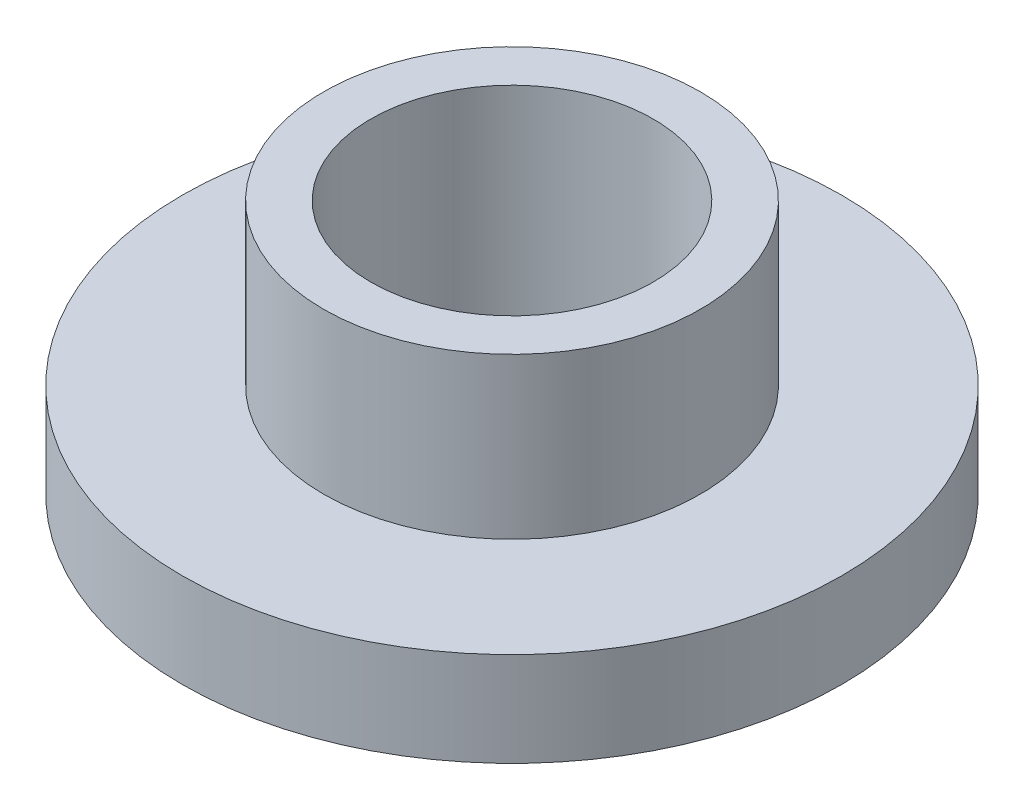
ISO-10303-21;
HEADER;
FILE_DESCRIPTION(('STEP AP214'),'2;1');
FILE_NAME('part.step','',(''),(''),'','','');
FILE_SCHEMA(('AUTOMOTIVE_DESIGN { 1 0 10303 214 1 1 1 1 }'));
ENDSEC;
DATA;
#1=APPLICATION_CONTEXT('core data for automotive mechanical design processes');
#2=APPLICATION_PROTOCOL_DEFINITION('international standard','automotive_design',2000,#1);
#3=PRODUCT_CONTEXT('',#1,'mechanical');
#4=PRODUCT('Part','Part','',(#3));
#5=PRODUCT_RELATED_PRODUCT_CATEGORY('part','',(#4));
#6=PRODUCT_DEFINITION_FORMATION('','',#4);
#7=PRODUCT_DEFINITION_CONTEXT('part definition',#1,'design');
#8=PRODUCT_DEFINITION('design','',#6,#7);
#9=PRODUCT_DEFINITION_SHAPE('','',#8);
#10=(LENGTH_UNIT() NAMED_UNIT(*) SI_UNIT(.MILLI.,.METRE.));
#11=(NAMED_UNIT(*) PLANE_ANGLE_UNIT() SI_UNIT($,.RADIAN.));
#12=(NAMED_UNIT(*) SI_UNIT($,.STERADIAN.) SOLID_ANGLE_UNIT());
#13=UNCERTAINTY_MEASURE_WITH_UNIT(LENGTH_MEASURE(1.E-05),#10,'distance_accuracy_value','');
#14=(GEOMETRIC_REPRESENTATION_CONTEXT(3) GLOBAL_UNCERTAINTY_ASSIGNED_CONTEXT((#13)) GLOBAL_UNIT_ASSIGNED_CONTEXT((#10,
#11,#12)) REPRESENTATION_CONTEXT('',''));
#15=CARTESIAN_POINT('',(0.,0.,0.));
#16=DIRECTION('',(0.,0.,1.));
#17=DIRECTION('',(1.,0.,0.));
#18=AXIS2_PLACEMENT_3D('',#15,#16,#17);
#19=CARTESIAN_POINT('',(0.,2.,0.));
#20=DIRECTION('',(0.,-1.,0.));
#21=DIRECTION('',(0.,0.,-1.));
#22=AXIS2_PLACEMENT_3D('',#19,#20,#21);
#23=CYLINDRICAL_SURFACE('',#22,7.);
#24=CARTESIAN_POINT('',(0.,2.,0.));
#25=DIRECTION('',(0.,1.,0.));
#26=DIRECTION('',(0.,0.,1.));
#27=AXIS2_PLACEMENT_3D('',#24,#25,#26);
#28=CIRCLE('',#27,7.);
#29=CARTESIAN_POINT('',(0.,2.,7.));
#30=VERTEX_POINT('',#29);
#31=EDGE_CURVE('E44',#30,#30,#28,.T.);
#32=ORIENTED_EDGE('',*,*,#31,.F.);
#33=EDGE_LOOP('',(#32));
#34=FACE_BOUND('',#33,.T.);
#35=CARTESIAN_POINT('',(0.,0.,0.));
#36=DIRECTION('',(0.,1.,0.));
#37=DIRECTION('',(0.,0.,1.));
#38=AXIS2_PLACEMENT_3D('',#35,#36,#37);
#39=CIRCLE('',#38,7.);
#40=CARTESIAN_POINT('',(0.,0.,7.));
#41=VERTEX_POINT('',#40);
#42=EDGE_CURVE('E40',#41,#41,#39,.T.);
#43=ORIENTED_EDGE('',*,*,#42,.T.);
#44=EDGE_LOOP('',(#43));
#45=FACE_BOUND('',#44,.T.);
#46=ADVANCED_FACE('F37',(#34,#45),#23,.T.);
#47=CARTESIAN_POINT('',(0.,2.,0.));
#48=DIRECTION('',(0.,1.,0.));
#49=DIRECTION('',(0.,0.,1.));
#50=AXIS2_PLACEMENT_3D('',#47,#48,#49);
#51=PLANE('',#50);
#52=CARTESIAN_POINT('',(0.,2.,0.));
#53=DIRECTION('',(0.,1.,0.));
#54=DIRECTION('',(0.,0.,1.));
#55=AXIS2_PLACEMENT_3D('',#52,#53,#54);
#56=CIRCLE('',#55,4.);
#57=CARTESIAN_POINT('',(0.,2.,4.));
#58=VERTEX_POINT('',#57);
#59=EDGE_CURVE('E10',#58,#58,#56,.T.);
#60=ORIENTED_EDGE('',*,*,#59,.F.);
#61=EDGE_LOOP('',(#60));
#62=FACE_BOUND('',#61,.T.);
#63=ORIENTED_EDGE('',*,*,#31,.T.);
#64=EDGE_LOOP('',(#63));
#65=FACE_BOUND('',#64,.T.);
#66=ADVANCED_FACE('F82',(#62,#65),#51,.T.);
#67=CARTESIAN_POINT('',(0.,0.,0.));
#68=DIRECTION('',(0.,1.,0.));
#69=DIRECTION('',(0.,0.,1.));
#70=AXIS2_PLACEMENT_3D('',#67,#68,#69);
#71=PLANE('',#70);
#72=CARTESIAN_POINT('',(0.,0.,0.));
#73=DIRECTION('',(0.,1.,0.));
#74=DIRECTION('',(0.,0.,1.));
#75=AXIS2_PLACEMENT_3D('',#72,#73,#74);
#76=CIRCLE('',#75,3.);
#77=CARTESIAN_POINT('',(0.,0.,3.));
#78=VERTEX_POINT('',#77);
#79=EDGE_CURVE('E53',#78,#78,#76,.T.);
#80=ORIENTED_EDGE('',*,*,#79,.T.);
#81=EDGE_LOOP('',(#80));
#82=FACE_BOUND('',#81,.T.);
#83=ORIENTED_EDGE('',*,*,#42,.F.);
#84=EDGE_LOOP('',(#83));
#85=FACE_BOUND('',#84,.T.);
#86=ADVANCED_FACE('F60',(#82,#85),#71,.F.);
#87=CARTESIAN_POINT('',(0.,5.4,0.));
#88=DIRECTION('',(0.,-1.,0.));
#89=DIRECTION('',(0.,0.,-1.));
#90=AXIS2_PLACEMENT_3D('',#87,#88,#89);
#91=CYLINDRICAL_SURFACE('',#90,4.);
#92=CARTESIAN_POINT('',(0.,5.4,0.));
#93=DIRECTION('',(0.,1.,0.));
#94=DIRECTION('',(0.,0.,1.));
#95=AXIS2_PLACEMENT_3D('',#92,#93,#94);
#96=CIRCLE('',#95,4.);
#97=CARTESIAN_POINT('',(0.,5.4,4.));
#98=VERTEX_POINT('',#97);
#99=EDGE_CURVE('E50',#98,#98,#96,.T.);
#100=ORIENTED_EDGE('',*,*,#99,.F.);
#101=EDGE_LOOP('',(#100));
#102=FACE_BOUND('',#101,.T.);
#103=ORIENTED_EDGE('',*,*,#59,.T.);
#104=EDGE_LOOP('',(#103));
#105=FACE_BOUND('',#104,.T.);
#106=ADVANCED_FACE('F72',(#102,#105),#91,.T.);
#107=CARTESIAN_POINT('',(0.,5.4,0.));
#108=DIRECTION('',(0.,1.,0.));
#109=DIRECTION('',(0.,0.,1.));
#110=AXIS2_PLACEMENT_3D('',#107,#108,#109);
#111=PLANE('',#110);
#112=CARTESIAN_POINT('',(0.,5.4,0.));
#113=DIRECTION('',(0.,1.,0.));
#114=DIRECTION('',(0.,0.,1.));
#115=AXIS2_PLACEMENT_3D('',#112,#113,#114);
#116=CIRCLE('',#115,3.);
#117=CARTESIAN_POINT('',(0.,5.4,3.));
#118=VERTEX_POINT('',#117);
#119=EDGE_CURVE('E54',#118,#118,#116,.T.);
#120=ORIENTED_EDGE('',*,*,#119,.F.);
#121=EDGE_LOOP('',(#120));
#122=FACE_BOUND('',#121,.T.);
#123=ORIENTED_EDGE('',*,*,#99,.T.);
#124=EDGE_LOOP('',(#123));
#125=FACE_BOUND('',#124,.T.);
#126=ADVANCED_FACE('F66',(#122,#125),#111,.T.);
#127=CARTESIAN_POINT('',(0.,0.,0.));
#128=DIRECTION('',(0.,1.,0.));
#129=DIRECTION('',(0.,0.,1.));
#130=AXIS2_PLACEMENT_3D('',#127,#128,#129);
#131=CYLINDRICAL_SURFACE('',#130,3.);
#132=CARTESIAN_POINT('',(0.,0.,3.));
#133=CARTESIAN_POINT('',(0.,0.05625,3.));
#134=CARTESIAN_POINT('',(0.,0.1125,3.));
#135=CARTESIAN_POINT('',(0.,0.225,3.));
#136=CARTESIAN_POINT('',(0.,0.28125,3.));
#137=CARTESIAN_POINT('',(0.,0.39375,3.));
#138=CARTESIAN_POINT('',(0.,0.45,3.));
#139=CARTESIAN_POINT('',(0.,0.5625,3.));
#140=CARTESIAN_POINT('',(0.,0.61875,3.));
#141=CARTESIAN_POINT('',(0.,0.73125,3.));
#142=CARTESIAN_POINT('',(0.,0.7875,3.));
#143=CARTESIAN_POINT('',(0.,0.9,3.));
#144=CARTESIAN_POINT('',(0.,0.95625,3.));
#145=CARTESIAN_POINT('',(0.,1.06875,3.));
#146=CARTESIAN_POINT('',(0.,1.125,3.));
#147=CARTESIAN_POINT('',(0.,1.2375,3.));
#148=CARTESIAN_POINT('',(0.,1.29375,3.));
#149=CARTESIAN_POINT('',(0.,1.40625,3.));
#150=CARTESIAN_POINT('',(0.,1.4625,3.));
#151=CARTESIAN_POINT('',(0.,1.575,3.));
#152=CARTESIAN_POINT('',(0.,1.63125,3.));
#153=CARTESIAN_POINT('',(0.,1.74375,3.));
#154=CARTESIAN_POINT('',(0.,1.8,3.));
#155=CARTESIAN_POINT('',(0.,1.9125,3.));
#156=CARTESIAN_POINT('',(0.,1.96875,3.));
#157=CARTESIAN_POINT('',(0.,2.08125,3.));
#158=CARTESIAN_POINT('',(0.,2.1375,3.));
#159=CARTESIAN_POINT('',(0.,2.25,3.));
#160=CARTESIAN_POINT('',(0.,2.30625,3.));
#161=CARTESIAN_POINT('',(0.,2.41875,3.));
#162=CARTESIAN_POINT('',(0.,2.475,3.));
#163=CARTESIAN_POINT('',(0.,2.5875,3.));
#164=CARTESIAN_POINT('',(0.,2.64375,3.));
#165=CARTESIAN_POINT('',(0.,2.75625,3.));
#166=CARTESIAN_POINT('',(0.,2.8125,3.));
#167=CARTESIAN_POINT('',(0.,2.925,3.));
#168=CARTESIAN_POINT('',(0.,2.98125,3.));
#169=CARTESIAN_POINT('',(0.,3.09375,3.));
#170=CARTESIAN_POINT('',(0.,3.15,3.));
#171=CARTESIAN_POINT('',(0.,3.2625,3.));
#172=CARTESIAN_POINT('',(0.,3.31875,3.));
#173=CARTESIAN_POINT('',(0.,3.43125,3.));
#174=CARTESIAN_POINT('',(0.,3.4875,3.));
#175=CARTESIAN_POINT('',(0.,3.6,3.));
#176=CARTESIAN_POINT('',(0.,3.65625,3.));
#177=CARTESIAN_POINT('',(0.,3.76875,3.));
#178=CARTESIAN_POINT('',(0.,3.825,3.));
#179=CARTESIAN_POINT('',(0.,3.9375,3.));
#180=CARTESIAN_POINT('',(0.,3.99375,3.));
#181=CARTESIAN_POINT('',(0.,4.10625,3.));
#182=CARTESIAN_POINT('',(0.,4.1625,3.));
#183=CARTESIAN_POINT('',(0.,4.275,3.));
#184=CARTESIAN_POINT('',(0.,4.33125,3.));
#185=CARTESIAN_POINT('',(0.,4.44375,3.));
#186=CARTESIAN_POINT('',(0.,4.5,3.));
#187=CARTESIAN_POINT('',(0.,4.6125,3.));
#188=CARTESIAN_POINT('',(0.,4.66875,3.));
#189=CARTESIAN_POINT('',(0.,4.78125,3.));
#190=CARTESIAN_POINT('',(0.,4.8375,3.));
#191=CARTESIAN_POINT('',(0.,4.95,3.));
#192=CARTESIAN_POINT('',(0.,5.00625,3.));
#193=CARTESIAN_POINT('',(0.,5.11875,3.));
#194=CARTESIAN_POINT('',(0.,5.175,3.));
#195=CARTESIAN_POINT('',(0.,5.2875,3.));
#196=CARTESIAN_POINT('',(0.,5.34375,3.));
#197=CARTESIAN_POINT('',(0.,5.4,3.));
#198=B_SPLINE_CURVE_WITH_KNOTS('',3,(#132,#133,#134,#135,#136,#137,#138,#139,#140,#141,#142,
#143,#144,#145,#146,#147,#148,#149,#150,#151,#152,#153,#154,#155,#156,#157,#158,#159,#160,#161,
#162,#163,#164,#165,#166,#167,#168,#169,#170,#171,#172,#173,#174,#175,#176,#177,#178,#179,#180,
#181,#182,#183,#184,#185,#186,#187,#188,#189,#190,#191,#192,#193,#194,#195,#196,#197),
.UNSPECIFIED.,.F.,.F.,(4,2,2,2,2,2,2,2,2,2,2,2,2,2,2,2,2,2,2,2,2,2,2,2,2,2,2,2,2,2,2,2,4),(0.,
0.16875,0.3375,0.50625,0.675,0.84375,1.0125,1.18125,1.35,1.51875,1.6875,1.85625,2.025,2.19375,
2.3625,2.53125,2.7,2.86875,3.0375,3.20625,3.375,3.54375,3.7125,3.88125,4.05,4.21875,4.3875,
4.55625,4.725,4.89375,5.0625,5.23125,5.4),.UNSPECIFIED.);
#199=EDGE_CURVE('BSEAM63',#78,#118,#198,.T.);
#200=ORIENTED_EDGE('',*,*,#79,.F.);
#201=ORIENTED_EDGE('',*,*,#119,.T.);
#202=ORIENTED_EDGE('',*,*,#199,.T.);
#203=ORIENTED_EDGE('',*,*,#199,.F.);
#204=EDGE_LOOP('',(#200,#202,#201,#203));
#205=FACE_BOUND('',#204,.T.);
#206=ADVANCED_FACE('F63',(#205),#131,.F.);
#207=CLOSED_SHELL('',(#46,#66,#86,#106,#126,#206));
#208=MANIFOLD_SOLID_BREP('B2',#207);
#209=ADVANCED_BREP_SHAPE_REPRESENTATION('',(#18,#208),#14);
#210=SHAPE_DEFINITION_REPRESENTATION(#9,#209);
ENDSEC;
END-ISO-10303-21;
